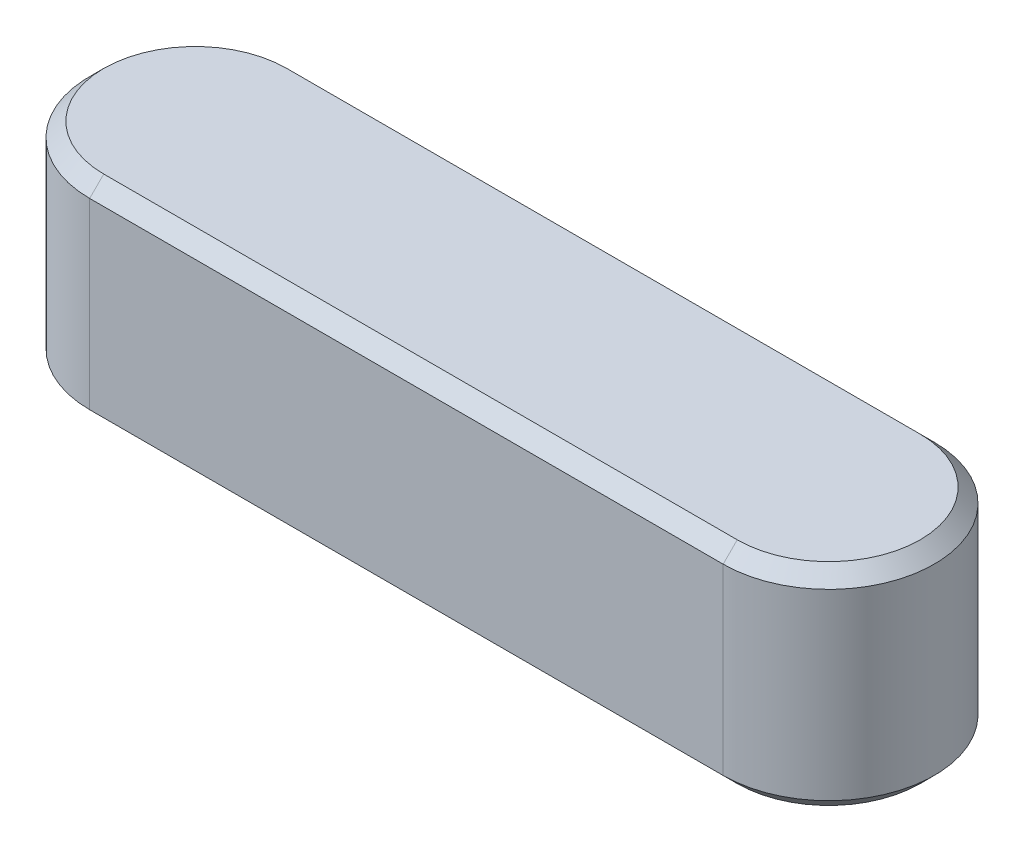
ISO-10303-21;
HEADER;
FILE_DESCRIPTION(('STEP AP214'),'2;1');
FILE_NAME('part.step','',(''),(''),'','','');
FILE_SCHEMA(('AUTOMOTIVE_DESIGN { 1 0 10303 214 1 1 1 1 }'));
ENDSEC;
DATA;
#1=APPLICATION_CONTEXT('core data for automotive mechanical design processes');
#2=APPLICATION_PROTOCOL_DEFINITION('international standard','automotive_design',2000,#1);
#3=PRODUCT_CONTEXT('',#1,'mechanical');
#4=PRODUCT('Part','Part','',(#3));
#5=PRODUCT_RELATED_PRODUCT_CATEGORY('part','',(#4));
#6=PRODUCT_DEFINITION_FORMATION('','',#4);
#7=PRODUCT_DEFINITION_CONTEXT('part definition',#1,'design');
#8=PRODUCT_DEFINITION('design','',#6,#7);
#9=PRODUCT_DEFINITION_SHAPE('','',#8);
#10=(LENGTH_UNIT() NAMED_UNIT(*) SI_UNIT(.MILLI.,.METRE.));
#11=(NAMED_UNIT(*) PLANE_ANGLE_UNIT() SI_UNIT($,.RADIAN.));
#12=(NAMED_UNIT(*) SI_UNIT($,.STERADIAN.) SOLID_ANGLE_UNIT());
#13=UNCERTAINTY_MEASURE_WITH_UNIT(LENGTH_MEASURE(1.E-05),#10,'distance_accuracy_value','');
#14=(GEOMETRIC_REPRESENTATION_CONTEXT(3) GLOBAL_UNCERTAINTY_ASSIGNED_CONTEXT((#13)) GLOBAL_UNIT_ASSIGNED_CONTEXT((#10,
#11,#12)) REPRESENTATION_CONTEXT('',''));
#15=CARTESIAN_POINT('',(0.,0.,0.));
#16=DIRECTION('',(0.,0.,1.));
#17=DIRECTION('',(1.,0.,0.));
#18=AXIS2_PLACEMENT_3D('',#15,#16,#17);
#19=CARTESIAN_POINT('',(4.5,0.,0.));
#20=DIRECTION('',(0.,-1.,0.));
#21=DIRECTION('',(0.,0.,-1.));
#22=AXIS2_PLACEMENT_3D('',#19,#20,#21);
#23=CYLINDRICAL_SURFACE('',#22,1.5);
#24=DIRECTION('',(0.,-1.,0.));
#25=VECTOR('',#24,1.);
#26=CARTESIAN_POINT('',(4.5,3.,1.5));
#27=LINE('',#26,#25);
#28=CARTESIAN_POINT('',(4.5,0.199999999999999,1.5));
#29=VERTEX_POINT('',#28);
#30=CARTESIAN_POINT('',(4.5,2.8,1.5));
#31=VERTEX_POINT('',#30);
#32=EDGE_CURVE('E134',#29,#31,#27,.F.);
#33=ORIENTED_EDGE('',*,*,#32,.F.);
#34=CARTESIAN_POINT('',(4.5,0.199999999999999,0.));
#35=DIRECTION('',(0.,1.,0.));
#36=DIRECTION('',(0.,0.,1.));
#37=AXIS2_PLACEMENT_3D('',#34,#35,#36);
#38=CIRCLE('',#37,1.5);
#39=CARTESIAN_POINT('',(4.5,0.199999999999999,-1.5));
#40=VERTEX_POINT('',#39);
#41=EDGE_CURVE('E119',#29,#40,#38,.T.);
#42=ORIENTED_EDGE('',*,*,#41,.T.);
#43=DIRECTION('',(0.,-1.,0.));
#44=VECTOR('',#43,1.);
#45=CARTESIAN_POINT('',(4.5,3.,-1.5));
#46=LINE('',#45,#44);
#47=CARTESIAN_POINT('',(4.5,2.8,-1.5));
#48=VERTEX_POINT('',#47);
#49=EDGE_CURVE('E127',#48,#40,#46,.T.);
#50=ORIENTED_EDGE('',*,*,#49,.F.);
#51=CARTESIAN_POINT('',(4.5,2.8,0.));
#52=DIRECTION('',(0.,1.,0.));
#53=DIRECTION('',(0.,0.,1.));
#54=AXIS2_PLACEMENT_3D('',#51,#52,#53);
#55=CIRCLE('',#54,1.5);
#56=EDGE_CURVE('E112',#48,#31,#55,.F.);
#57=ORIENTED_EDGE('',*,*,#56,.T.);
#58=EDGE_LOOP('',(#33,#42,#50,#57));
#59=FACE_BOUND('',#58,.T.);
#60=ADVANCED_FACE('F37',(#59),#23,.T.);
#61=CARTESIAN_POINT('',(-4.5,3.,0.));
#62=DIRECTION('',(0.,-1.,0.));
#63=DIRECTION('',(0.,0.,-1.));
#64=AXIS2_PLACEMENT_3D('',#61,#62,#63);
#65=CYLINDRICAL_SURFACE('',#64,1.5);
#66=DIRECTION('',(0.,-1.,0.));
#67=VECTOR('',#66,1.);
#68=CARTESIAN_POINT('',(-4.5,3.,-1.5));
#69=LINE('',#68,#67);
#70=CARTESIAN_POINT('',(-4.5,0.199999999999999,-1.5));
#71=VERTEX_POINT('',#70);
#72=CARTESIAN_POINT('',(-4.5,2.8,-1.5));
#73=VERTEX_POINT('',#72);
#74=EDGE_CURVE('E130',#71,#73,#69,.F.);
#75=ORIENTED_EDGE('',*,*,#74,.F.);
#76=CARTESIAN_POINT('',(-4.5,0.199999999999999,0.));
#77=DIRECTION('',(0.,1.,0.));
#78=DIRECTION('',(0.,0.,1.));
#79=AXIS2_PLACEMENT_3D('',#76,#77,#78);
#80=CIRCLE('',#79,1.5);
#81=CARTESIAN_POINT('',(-4.5,0.199999999999999,1.5));
#82=VERTEX_POINT('',#81);
#83=EDGE_CURVE('E120',#71,#82,#80,.T.);
#84=ORIENTED_EDGE('',*,*,#83,.T.);
#85=DIRECTION('',(0.,-1.,0.));
#86=VECTOR('',#85,1.);
#87=CARTESIAN_POINT('',(-4.5,3.,1.5));
#88=LINE('',#87,#86);
#89=CARTESIAN_POINT('',(-4.5,2.8,1.5));
#90=VERTEX_POINT('',#89);
#91=EDGE_CURVE('E171',#90,#82,#88,.T.);
#92=ORIENTED_EDGE('',*,*,#91,.F.);
#93=CARTESIAN_POINT('',(-4.5,2.8,0.));
#94=DIRECTION('',(0.,1.,0.));
#95=DIRECTION('',(0.,0.,1.));
#96=AXIS2_PLACEMENT_3D('',#93,#94,#95);
#97=CIRCLE('',#96,1.5);
#98=EDGE_CURVE('E149',#90,#73,#97,.F.);
#99=ORIENTED_EDGE('',*,*,#98,.T.);
#100=EDGE_LOOP('',(#75,#84,#92,#99));
#101=FACE_BOUND('',#100,.T.);
#102=ADVANCED_FACE('F194',(#101),#65,.T.);
#103=CARTESIAN_POINT('',(-6.,3.,1.5));
#104=DIRECTION('',(0.,0.,-1.));
#105=DIRECTION('',(-1.,0.,0.));
#106=AXIS2_PLACEMENT_3D('',#103,#104,#105);
#107=PLANE('',#106);
#108=ORIENTED_EDGE('',*,*,#91,.T.);
#109=DIRECTION('',(1.,0.,0.));
#110=VECTOR('',#109,1.);
#111=CARTESIAN_POINT('',(-6.,0.199999999999999,1.5));
#112=LINE('',#111,#110);
#113=EDGE_CURVE('E155',#82,#29,#112,.T.);
#114=ORIENTED_EDGE('',*,*,#113,.T.);
#115=ORIENTED_EDGE('',*,*,#32,.T.);
#116=DIRECTION('',(-1.,0.,0.));
#117=VECTOR('',#116,1.);
#118=CARTESIAN_POINT('',(-4.5,2.8,1.5));
#119=LINE('',#118,#117);
#120=EDGE_CURVE('E153',#31,#90,#119,.T.);
#121=ORIENTED_EDGE('',*,*,#120,.T.);
#122=EDGE_LOOP('',(#108,#114,#115,#121));
#123=FACE_BOUND('',#122,.T.);
#124=ADVANCED_FACE('F191',(#123),#107,.F.);
#125=CARTESIAN_POINT('',(-6.,3.,-1.5));
#126=DIRECTION('',(0.,0.,1.));
#127=DIRECTION('',(1.,0.,0.));
#128=AXIS2_PLACEMENT_3D('',#125,#126,#127);
#129=PLANE('',#128);
#130=ORIENTED_EDGE('',*,*,#49,.T.);
#131=DIRECTION('',(-1.,0.,0.));
#132=VECTOR('',#131,1.);
#133=CARTESIAN_POINT('',(-6.,0.199999999999999,-1.5));
#134=LINE('',#133,#132);
#135=EDGE_CURVE('E131',#40,#71,#134,.T.);
#136=ORIENTED_EDGE('',*,*,#135,.T.);
#137=ORIENTED_EDGE('',*,*,#74,.T.);
#138=DIRECTION('',(1.,0.,0.));
#139=VECTOR('',#138,1.);
#140=CARTESIAN_POINT('',(4.5,2.8,-1.5));
#141=LINE('',#140,#139);
#142=EDGE_CURVE('E107',#73,#48,#141,.T.);
#143=ORIENTED_EDGE('',*,*,#142,.T.);
#144=EDGE_LOOP('',(#130,#136,#137,#143));
#145=FACE_BOUND('',#144,.T.);
#146=ADVANCED_FACE('F125',(#145),#129,.F.);
#147=CARTESIAN_POINT('',(0.,3.,0.));
#148=DIRECTION('',(0.,1.,0.));
#149=DIRECTION('',(0.,0.,1.));
#150=AXIS2_PLACEMENT_3D('',#147,#148,#149);
#151=PLANE('',#150);
#152=CARTESIAN_POINT('',(4.5,3.,0.));
#153=DIRECTION('',(0.,1.,0.));
#154=DIRECTION('',(0.,0.,1.));
#155=AXIS2_PLACEMENT_3D('',#152,#153,#154);
#156=CIRCLE('',#155,1.3);
#157=CARTESIAN_POINT('',(4.5,3.,1.3));
#158=VERTEX_POINT('',#157);
#159=CARTESIAN_POINT('',(4.5,3.,-1.3));
#160=VERTEX_POINT('',#159);
#161=EDGE_CURVE('E61',#158,#160,#156,.T.);
#162=ORIENTED_EDGE('',*,*,#161,.T.);
#163=DIRECTION('',(-1.,0.,0.));
#164=VECTOR('',#163,1.);
#165=CARTESIAN_POINT('',(-4.5,3.,-1.3));
#166=LINE('',#165,#164);
#167=CARTESIAN_POINT('',(-4.5,3.,-1.3));
#168=VERTEX_POINT('',#167);
#169=EDGE_CURVE('E11',#160,#168,#166,.T.);
#170=ORIENTED_EDGE('',*,*,#169,.T.);
#171=CARTESIAN_POINT('',(-4.5,3.,0.));
#172=DIRECTION('',(0.,1.,0.));
#173=DIRECTION('',(0.,0.,1.));
#174=AXIS2_PLACEMENT_3D('',#171,#172,#173);
#175=CIRCLE('',#174,1.3);
#176=CARTESIAN_POINT('',(-4.5,3.,1.3));
#177=VERTEX_POINT('',#176);
#178=EDGE_CURVE('E46',#168,#177,#175,.T.);
#179=ORIENTED_EDGE('',*,*,#178,.T.);
#180=DIRECTION('',(1.,0.,0.));
#181=VECTOR('',#180,1.);
#182=CARTESIAN_POINT('',(4.5,3.,1.3));
#183=LINE('',#182,#181);
#184=EDGE_CURVE('E157',#177,#158,#183,.T.);
#185=ORIENTED_EDGE('',*,*,#184,.T.);
#186=EDGE_LOOP('',(#162,#170,#179,#185));
#187=FACE_BOUND('',#186,.T.);
#188=ADVANCED_FACE('F180',(#187),#151,.T.);
#189=CARTESIAN_POINT('',(0.,0.,0.));
#190=DIRECTION('',(0.,1.,0.));
#191=DIRECTION('',(0.,0.,1.));
#192=AXIS2_PLACEMENT_3D('',#189,#190,#191);
#193=PLANE('',#192);
#194=CARTESIAN_POINT('',(-4.5,0.,0.));
#195=DIRECTION('',(0.,1.,0.));
#196=DIRECTION('',(0.,0.,1.));
#197=AXIS2_PLACEMENT_3D('',#194,#195,#196);
#198=CIRCLE('',#197,1.3);
#199=CARTESIAN_POINT('',(-4.5,0.,1.3));
#200=VERTEX_POINT('',#199);
#201=CARTESIAN_POINT('',(-4.5,0.,-1.3));
#202=VERTEX_POINT('',#201);
#203=EDGE_CURVE('E144',#200,#202,#198,.F.);
#204=ORIENTED_EDGE('',*,*,#203,.T.);
#205=DIRECTION('',(1.,0.,0.));
#206=VECTOR('',#205,1.);
#207=CARTESIAN_POINT('',(0.,0.,-1.3));
#208=LINE('',#207,#206);
#209=CARTESIAN_POINT('',(4.5,0.,-1.3));
#210=VERTEX_POINT('',#209);
#211=EDGE_CURVE('E146',#202,#210,#208,.T.);
#212=ORIENTED_EDGE('',*,*,#211,.T.);
#213=CARTESIAN_POINT('',(4.5,0.,0.));
#214=DIRECTION('',(0.,1.,0.));
#215=DIRECTION('',(0.,0.,1.));
#216=AXIS2_PLACEMENT_3D('',#213,#214,#215);
#217=CIRCLE('',#216,1.3);
#218=CARTESIAN_POINT('',(4.5,0.,1.3));
#219=VERTEX_POINT('',#218);
#220=EDGE_CURVE('E142',#210,#219,#217,.F.);
#221=ORIENTED_EDGE('',*,*,#220,.T.);
#222=DIRECTION('',(-1.,0.,0.));
#223=VECTOR('',#222,1.);
#224=CARTESIAN_POINT('',(0.,0.,1.3));
#225=LINE('',#224,#223);
#226=EDGE_CURVE('E140',#219,#200,#225,.T.);
#227=ORIENTED_EDGE('',*,*,#226,.T.);
#228=EDGE_LOOP('',(#204,#212,#221,#227));
#229=FACE_BOUND('',#228,.T.);
#230=ADVANCED_FACE('F182',(#229),#193,.F.);
#231=CARTESIAN_POINT('',(-6.,0.199999999999999,1.5));
#232=DIRECTION('',(0.,0.70710678118655,-0.707106781186545));
#233=DIRECTION('',(1.,0.,0.));
#234=AXIS2_PLACEMENT_3D('',#231,#232,#233);
#235=PLANE('',#234);
#236=DIRECTION('',(0.,0.707106781186545,0.70710678118655));
#237=VECTOR('',#236,1.);
#238=CARTESIAN_POINT('',(-4.5,0.,1.3));
#239=LINE('',#238,#237);
#240=EDGE_CURVE('E165',#200,#82,#239,.T.);
#241=ORIENTED_EDGE('',*,*,#240,.F.);
#242=ORIENTED_EDGE('',*,*,#226,.F.);
#243=DIRECTION('',(0.,-0.707106781186545,-0.70710678118655));
#244=VECTOR('',#243,1.);
#245=CARTESIAN_POINT('',(4.5,0.199999999999999,1.5));
#246=LINE('',#245,#244);
#247=EDGE_CURVE('E168',#29,#219,#246,.T.);
#248=ORIENTED_EDGE('',*,*,#247,.F.);
#249=ORIENTED_EDGE('',*,*,#113,.F.);
#250=EDGE_LOOP('',(#241,#242,#248,#249));
#251=FACE_BOUND('',#250,.T.);
#252=ADVANCED_FACE('F188',(#251),#235,.F.);
#253=CARTESIAN_POINT('',(4.5,0.,0.));
#254=DIRECTION('',(0.,1.,0.));
#255=DIRECTION('',(0.,0.,1.));
#256=AXIS2_PLACEMENT_3D('',#253,#254,#255);
#257=CONICAL_SURFACE('',#256,1.3,0.785398163397453);
#258=ORIENTED_EDGE('',*,*,#247,.T.);
#259=ORIENTED_EDGE('',*,*,#220,.F.);
#260=DIRECTION('',(0.,-0.707106781186544,0.707106781186551));
#261=VECTOR('',#260,1.);
#262=CARTESIAN_POINT('',(4.5,0.199999999999999,-1.5));
#263=LINE('',#262,#261);
#264=EDGE_CURVE('E163',#40,#210,#263,.T.);
#265=ORIENTED_EDGE('',*,*,#264,.F.);
#266=ORIENTED_EDGE('',*,*,#41,.F.);
#267=EDGE_LOOP('',(#258,#259,#265,#266));
#268=FACE_BOUND('',#267,.T.);
#269=ADVANCED_FACE('F210',(#268),#257,.T.);
#270=CARTESIAN_POINT('',(-4.5,0.,0.));
#271=DIRECTION('',(0.,1.,0.));
#272=DIRECTION('',(0.,0.,1.));
#273=AXIS2_PLACEMENT_3D('',#270,#271,#272);
#274=CONICAL_SURFACE('',#273,1.3,0.785398163397453);
#275=ORIENTED_EDGE('',*,*,#240,.T.);
#276=ORIENTED_EDGE('',*,*,#83,.F.);
#277=DIRECTION('',(0.,0.707106781186544,-0.707106781186551));
#278=VECTOR('',#277,1.);
#279=CARTESIAN_POINT('',(-4.5,0.,-1.3));
#280=LINE('',#279,#278);
#281=EDGE_CURVE('E161',#202,#71,#280,.T.);
#282=ORIENTED_EDGE('',*,*,#281,.F.);
#283=ORIENTED_EDGE('',*,*,#203,.F.);
#284=EDGE_LOOP('',(#275,#276,#282,#283));
#285=FACE_BOUND('',#284,.T.);
#286=ADVANCED_FACE('F206',(#285),#274,.T.);
#287=CARTESIAN_POINT('',(-6.,0.199999999999999,-1.5));
#288=DIRECTION('',(0.,0.70710678118655,0.707106781186545));
#289=DIRECTION('',(-1.,0.,0.));
#290=AXIS2_PLACEMENT_3D('',#287,#288,#289);
#291=PLANE('',#290);
#292=ORIENTED_EDGE('',*,*,#264,.T.);
#293=ORIENTED_EDGE('',*,*,#211,.F.);
#294=ORIENTED_EDGE('',*,*,#281,.T.);
#295=ORIENTED_EDGE('',*,*,#135,.F.);
#296=EDGE_LOOP('',(#292,#293,#294,#295));
#297=FACE_BOUND('',#296,.T.);
#298=ADVANCED_FACE('F203',(#297),#291,.F.);
#299=CARTESIAN_POINT('',(0.,3.,1.3));
#300=DIRECTION('',(0.,0.70710678118655,0.707106781186545));
#301=DIRECTION('',(-1.,0.,0.));
#302=AXIS2_PLACEMENT_3D('',#299,#300,#301);
#303=PLANE('',#302);
#304=DIRECTION('',(0.,0.707106781186544,-0.707106781186551));
#305=VECTOR('',#304,1.);
#306=CARTESIAN_POINT('',(-4.5,2.8,1.5));
#307=LINE('',#306,#305);
#308=EDGE_CURVE('E109',#90,#177,#307,.T.);
#309=ORIENTED_EDGE('',*,*,#308,.F.);
#310=ORIENTED_EDGE('',*,*,#120,.F.);
#311=DIRECTION('',(0.,-0.707106781186544,0.707106781186551));
#312=VECTOR('',#311,1.);
#313=CARTESIAN_POINT('',(4.5,3.,1.3));
#314=LINE('',#313,#312);
#315=EDGE_CURVE('E41',#158,#31,#314,.T.);
#316=ORIENTED_EDGE('',*,*,#315,.F.);
#317=ORIENTED_EDGE('',*,*,#184,.F.);
#318=EDGE_LOOP('',(#309,#310,#316,#317));
#319=FACE_BOUND('',#318,.T.);
#320=ADVANCED_FACE('F39',(#319),#303,.T.);
#321=CARTESIAN_POINT('',(4.5,3.,0.));
#322=DIRECTION('',(0.,-1.,0.));
#323=DIRECTION('',(0.,0.,-1.));
#324=AXIS2_PLACEMENT_3D('',#321,#322,#323);
#325=CONICAL_SURFACE('',#324,1.3,0.785398163397453);
#326=ORIENTED_EDGE('',*,*,#315,.T.);
#327=ORIENTED_EDGE('',*,*,#56,.F.);
#328=DIRECTION('',(0.,-0.707106781186544,-0.707106781186551));
#329=VECTOR('',#328,1.);
#330=CARTESIAN_POINT('',(4.5,3.,-1.3));
#331=LINE('',#330,#329);
#332=EDGE_CURVE('E103',#160,#48,#331,.T.);
#333=ORIENTED_EDGE('',*,*,#332,.F.);
#334=ORIENTED_EDGE('',*,*,#161,.F.);
#335=EDGE_LOOP('',(#326,#327,#333,#334));
#336=FACE_BOUND('',#335,.T.);
#337=ADVANCED_FACE('F113',(#336),#325,.T.);
#338=CARTESIAN_POINT('',(-4.5,3.,0.));
#339=DIRECTION('',(0.,-1.,0.));
#340=DIRECTION('',(0.,0.,-1.));
#341=AXIS2_PLACEMENT_3D('',#338,#339,#340);
#342=CONICAL_SURFACE('',#341,1.3,0.785398163397453);
#343=ORIENTED_EDGE('',*,*,#308,.T.);
#344=ORIENTED_EDGE('',*,*,#178,.F.);
#345=DIRECTION('',(0.,0.707106781186544,0.707106781186551));
#346=VECTOR('',#345,1.);
#347=CARTESIAN_POINT('',(-4.5,2.8,-1.5));
#348=LINE('',#347,#346);
#349=EDGE_CURVE('E54',#73,#168,#348,.T.);
#350=ORIENTED_EDGE('',*,*,#349,.F.);
#351=ORIENTED_EDGE('',*,*,#98,.F.);
#352=EDGE_LOOP('',(#343,#344,#350,#351));
#353=FACE_BOUND('',#352,.T.);
#354=ADVANCED_FACE('F176',(#353),#342,.T.);
#355=CARTESIAN_POINT('',(0.,3.,-1.3));
#356=DIRECTION('',(0.,0.70710678118655,-0.707106781186545));
#357=DIRECTION('',(1.,0.,0.));
#358=AXIS2_PLACEMENT_3D('',#355,#356,#357);
#359=PLANE('',#358);
#360=ORIENTED_EDGE('',*,*,#332,.T.);
#361=ORIENTED_EDGE('',*,*,#142,.F.);
#362=ORIENTED_EDGE('',*,*,#349,.T.);
#363=ORIENTED_EDGE('',*,*,#169,.F.);
#364=EDGE_LOOP('',(#360,#361,#362,#363));
#365=FACE_BOUND('',#364,.T.);
#366=ADVANCED_FACE('F105',(#365),#359,.T.);
#367=CLOSED_SHELL('',(#60,#102,#124,#146,#188,#230,#252,#269,#286,#298,#320,#337,#354,#366));
#368=MANIFOLD_SOLID_BREP('B2',#367);
#369=ADVANCED_BREP_SHAPE_REPRESENTATION('',(#18,#368),#14);
#370=SHAPE_DEFINITION_REPRESENTATION(#9,#369);
ENDSEC;
END-ISO-10303-21;
